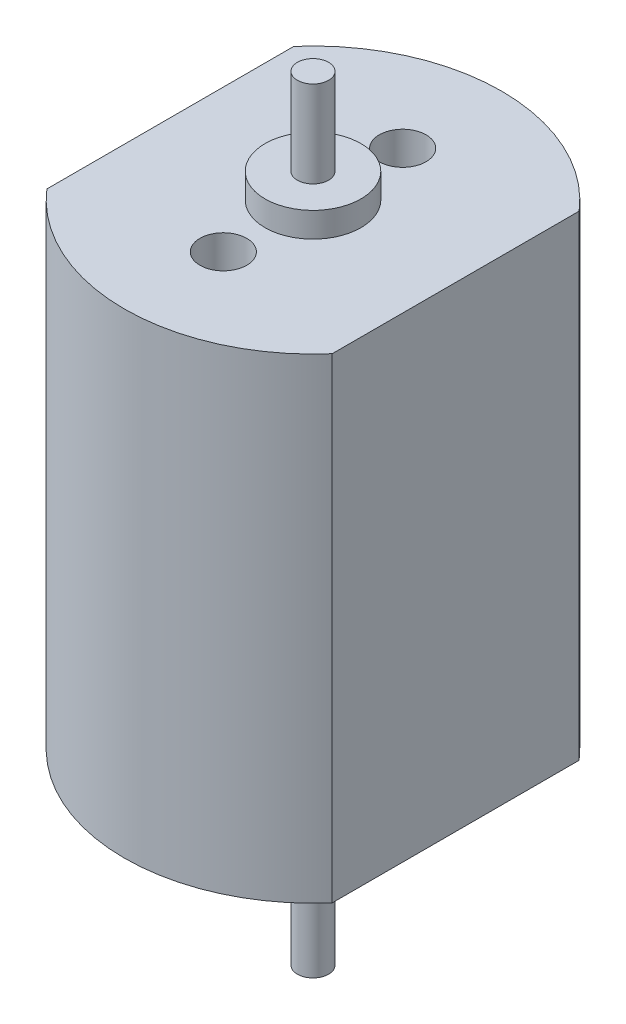
ISO-10303-21;
HEADER;
FILE_DESCRIPTION(('STEP AP214'),'2;1');
FILE_NAME('part.step','',(''),(''),'','','');
FILE_SCHEMA(('AUTOMOTIVE_DESIGN { 1 0 10303 214 1 1 1 1 }'));
ENDSEC;
DATA;
#1=APPLICATION_CONTEXT('core data for automotive mechanical design processes');
#2=APPLICATION_PROTOCOL_DEFINITION('international standard','automotive_design',2000,#1);
#3=PRODUCT_CONTEXT('',#1,'mechanical');
#4=PRODUCT('Part','Part','',(#3));
#5=PRODUCT_RELATED_PRODUCT_CATEGORY('part','',(#4));
#6=PRODUCT_DEFINITION_FORMATION('','',#4);
#7=PRODUCT_DEFINITION_CONTEXT('part definition',#1,'design');
#8=PRODUCT_DEFINITION('design','',#6,#7);
#9=PRODUCT_DEFINITION_SHAPE('','',#8);
#10=(LENGTH_UNIT() NAMED_UNIT(*) SI_UNIT(.MILLI.,.METRE.));
#11=(NAMED_UNIT(*) PLANE_ANGLE_UNIT() SI_UNIT($,.RADIAN.));
#12=(NAMED_UNIT(*) SI_UNIT($,.STERADIAN.) SOLID_ANGLE_UNIT());
#13=UNCERTAINTY_MEASURE_WITH_UNIT(LENGTH_MEASURE(1.E-05),#10,'distance_accuracy_value','');
#14=(GEOMETRIC_REPRESENTATION_CONTEXT(3) GLOBAL_UNCERTAINTY_ASSIGNED_CONTEXT((#13)) GLOBAL_UNIT_ASSIGNED_CONTEXT((#10,
#11,#12)) REPRESENTATION_CONTEXT('',''));
#15=CARTESIAN_POINT('',(0.,0.,0.));
#16=DIRECTION('',(0.,0.,1.));
#17=DIRECTION('',(1.,0.,0.));
#18=AXIS2_PLACEMENT_3D('',#15,#16,#17);
#19=CARTESIAN_POINT('',(0.,30.5,0.));
#20=DIRECTION('',(0.,-1.,0.));
#21=DIRECTION('',(0.,0.,-1.));
#22=AXIS2_PLACEMENT_3D('',#19,#20,#21);
#23=CYLINDRICAL_SURFACE('',#22,12.1);
#24=CARTESIAN_POINT('',(0.,0.,0.));
#25=DIRECTION('',(0.,1.,0.));
#26=DIRECTION('',(0.,0.,1.));
#27=AXIS2_PLACEMENT_3D('',#24,#25,#26);
#28=CIRCLE('',#27,12.1);
#29=CARTESIAN_POINT('',(-9.15,0.,7.91754381105656));
#30=VERTEX_POINT('',#29);
#31=CARTESIAN_POINT('',(9.15,0.,7.91754381105656));
#32=VERTEX_POINT('',#31);
#33=EDGE_CURVE('E114',#30,#32,#28,.T.);
#34=ORIENTED_EDGE('',*,*,#33,.T.);
#35=DIRECTION('',(0.,-1.,0.));
#36=VECTOR('',#35,1.);
#37=CARTESIAN_POINT('',(9.15,30.5,7.91754381105656));
#38=LINE('',#37,#36);
#39=CARTESIAN_POINT('',(9.15,30.5,7.91754381105656));
#40=VERTEX_POINT('',#39);
#41=EDGE_CURVE('E50',#40,#32,#38,.T.);
#42=ORIENTED_EDGE('',*,*,#41,.F.);
#43=CARTESIAN_POINT('',(0.,30.5,0.));
#44=DIRECTION('',(0.,1.,0.));
#45=DIRECTION('',(0.,0.,1.));
#46=AXIS2_PLACEMENT_3D('',#43,#44,#45);
#47=CIRCLE('',#46,12.1);
#48=CARTESIAN_POINT('',(-9.15,30.5,7.91754381105656));
#49=VERTEX_POINT('',#48);
#50=EDGE_CURVE('E101',#49,#40,#47,.T.);
#51=ORIENTED_EDGE('',*,*,#50,.F.);
#52=DIRECTION('',(0.,-1.,0.));
#53=VECTOR('',#52,1.);
#54=CARTESIAN_POINT('',(-9.15,30.5,7.91754381105656));
#55=LINE('',#54,#53);
#56=EDGE_CURVE('E110',#49,#30,#55,.T.);
#57=ORIENTED_EDGE('',*,*,#56,.T.);
#58=EDGE_LOOP('',(#34,#42,#51,#57));
#59=FACE_BOUND('',#58,.T.);
#60=ADVANCED_FACE('F47',(#59),#23,.T.);
#61=CARTESIAN_POINT('',(9.15,30.5,-7.91754381105656));
#62=DIRECTION('',(-1.,0.,0.));
#63=DIRECTION('',(0.,0.,1.));
#64=AXIS2_PLACEMENT_3D('',#61,#62,#63);
#65=PLANE('',#64);
#66=DIRECTION('',(0.,0.,-1.));
#67=VECTOR('',#66,1.);
#68=CARTESIAN_POINT('',(9.15,0.,-7.91754381105656));
#69=LINE('',#68,#67);
#70=CARTESIAN_POINT('',(9.15,0.,-7.91754381105656));
#71=VERTEX_POINT('',#70);
#72=EDGE_CURVE('E106',#32,#71,#69,.T.);
#73=ORIENTED_EDGE('',*,*,#72,.T.);
#74=DIRECTION('',(0.,-1.,0.));
#75=VECTOR('',#74,1.);
#76=CARTESIAN_POINT('',(9.15,30.5,-7.91754381105656));
#77=LINE('',#76,#75);
#78=CARTESIAN_POINT('',(9.15,30.5,-7.91754381105656));
#79=VERTEX_POINT('',#78);
#80=EDGE_CURVE('E104',#79,#71,#77,.T.);
#81=ORIENTED_EDGE('',*,*,#80,.F.);
#82=DIRECTION('',(0.,0.,-1.));
#83=VECTOR('',#82,1.);
#84=CARTESIAN_POINT('',(9.15,30.5,-7.91754381105656));
#85=LINE('',#84,#83);
#86=EDGE_CURVE('E96',#40,#79,#85,.T.);
#87=ORIENTED_EDGE('',*,*,#86,.F.);
#88=ORIENTED_EDGE('',*,*,#41,.T.);
#89=EDGE_LOOP('',(#73,#81,#87,#88));
#90=FACE_BOUND('',#89,.T.);
#91=ADVANCED_FACE('F105',(#90),#65,.F.);
#92=CARTESIAN_POINT('',(0.,30.5,0.));
#93=DIRECTION('',(0.,-1.,0.));
#94=DIRECTION('',(0.,0.,-1.));
#95=AXIS2_PLACEMENT_3D('',#92,#93,#94);
#96=CYLINDRICAL_SURFACE('',#95,12.1);
#97=CARTESIAN_POINT('',(0.,0.,0.));
#98=DIRECTION('',(0.,1.,0.));
#99=DIRECTION('',(0.,0.,1.));
#100=AXIS2_PLACEMENT_3D('',#97,#98,#99);
#101=CIRCLE('',#100,12.1);
#102=CARTESIAN_POINT('',(-9.15,0.,-7.91754381105656));
#103=VERTEX_POINT('',#102);
#104=EDGE_CURVE('E82',#71,#103,#101,.T.);
#105=ORIENTED_EDGE('',*,*,#104,.T.);
#106=DIRECTION('',(0.,-1.,0.));
#107=VECTOR('',#106,1.);
#108=CARTESIAN_POINT('',(-9.15,30.5,-7.91754381105656));
#109=LINE('',#108,#107);
#110=CARTESIAN_POINT('',(-9.15,30.5,-7.91754381105656));
#111=VERTEX_POINT('',#110);
#112=EDGE_CURVE('E107',#111,#103,#109,.T.);
#113=ORIENTED_EDGE('',*,*,#112,.F.);
#114=CARTESIAN_POINT('',(0.,30.5,0.));
#115=DIRECTION('',(0.,1.,0.));
#116=DIRECTION('',(0.,0.,1.));
#117=AXIS2_PLACEMENT_3D('',#114,#115,#116);
#118=CIRCLE('',#117,12.1);
#119=EDGE_CURVE('E99',#79,#111,#118,.T.);
#120=ORIENTED_EDGE('',*,*,#119,.F.);
#121=ORIENTED_EDGE('',*,*,#80,.T.);
#122=EDGE_LOOP('',(#105,#113,#120,#121));
#123=FACE_BOUND('',#122,.T.);
#124=ADVANCED_FACE('F108',(#123),#96,.T.);
#125=CARTESIAN_POINT('',(-9.15,30.5,-7.91754381105656));
#126=DIRECTION('',(1.,0.,0.));
#127=DIRECTION('',(0.,0.,-1.));
#128=AXIS2_PLACEMENT_3D('',#125,#126,#127);
#129=PLANE('',#128);
#130=DIRECTION('',(0.,0.,1.));
#131=VECTOR('',#130,1.);
#132=CARTESIAN_POINT('',(-9.15,0.,-7.91754381105656));
#133=LINE('',#132,#131);
#134=EDGE_CURVE('E88',#103,#30,#133,.T.);
#135=ORIENTED_EDGE('',*,*,#134,.T.);
#136=ORIENTED_EDGE('',*,*,#56,.F.);
#137=DIRECTION('',(0.,0.,1.));
#138=VECTOR('',#137,1.);
#139=CARTESIAN_POINT('',(-9.15,30.5,-7.91754381105656));
#140=LINE('',#139,#138);
#141=EDGE_CURVE('E65',#111,#49,#140,.T.);
#142=ORIENTED_EDGE('',*,*,#141,.F.);
#143=ORIENTED_EDGE('',*,*,#112,.T.);
#144=EDGE_LOOP('',(#135,#136,#142,#143));
#145=FACE_BOUND('',#144,.T.);
#146=ADVANCED_FACE('F122',(#145),#129,.F.);
#147=CARTESIAN_POINT('',(0.,30.5,0.));
#148=DIRECTION('',(0.,1.,0.));
#149=DIRECTION('',(0.,0.,1.));
#150=AXIS2_PLACEMENT_3D('',#147,#148,#149);
#151=PLANE('',#150);
#152=CARTESIAN_POINT('',(0.,30.5,-5.75));
#153=DIRECTION('',(0.,1.,0.));
#154=DIRECTION('',(0.,0.,1.));
#155=AXIS2_PLACEMENT_3D('',#152,#153,#154);
#156=CIRCLE('',#155,1.5);
#157=CARTESIAN_POINT('',(0.,30.5,-4.25));
#158=VERTEX_POINT('',#157);
#159=EDGE_CURVE('E154',#158,#158,#156,.T.);
#160=ORIENTED_EDGE('',*,*,#159,.F.);
#161=EDGE_LOOP('',(#160));
#162=FACE_BOUND('',#161,.T.);
#163=CARTESIAN_POINT('',(0.,30.5,5.75));
#164=DIRECTION('',(0.,1.,0.));
#165=DIRECTION('',(0.,0.,1.));
#166=AXIS2_PLACEMENT_3D('',#163,#164,#165);
#167=CIRCLE('',#166,1.5);
#168=CARTESIAN_POINT('',(0.,30.5,7.25));
#169=VERTEX_POINT('',#168);
#170=EDGE_CURVE('E151',#169,#169,#167,.T.);
#171=ORIENTED_EDGE('',*,*,#170,.F.);
#172=EDGE_LOOP('',(#171));
#173=FACE_BOUND('',#172,.T.);
#174=CARTESIAN_POINT('',(0.,30.5,0.));
#175=DIRECTION('',(0.,1.,0.));
#176=DIRECTION('',(0.,0.,1.));
#177=AXIS2_PLACEMENT_3D('',#174,#175,#176);
#178=CIRCLE('',#177,3.075);
#179=CARTESIAN_POINT('',(0.,30.5,3.075));
#180=VERTEX_POINT('',#179);
#181=EDGE_CURVE('E56',#180,#180,#178,.T.);
#182=ORIENTED_EDGE('',*,*,#181,.F.);
#183=EDGE_LOOP('',(#182));
#184=FACE_BOUND('',#183,.T.);
#185=ORIENTED_EDGE('',*,*,#50,.T.);
#186=ORIENTED_EDGE('',*,*,#86,.T.);
#187=ORIENTED_EDGE('',*,*,#119,.T.);
#188=ORIENTED_EDGE('',*,*,#141,.T.);
#189=EDGE_LOOP('',(#185,#186,#187,#188));
#190=FACE_BOUND('',#189,.T.);
#191=ADVANCED_FACE('F97',(#162,#173,#184,#190),#151,.T.);
#192=CARTESIAN_POINT('',(0.,0.,0.));
#193=DIRECTION('',(0.,1.,0.));
#194=DIRECTION('',(0.,0.,1.));
#195=AXIS2_PLACEMENT_3D('',#192,#193,#194);
#196=PLANE('',#195);
#197=CARTESIAN_POINT('',(0.,0.,0.));
#198=DIRECTION('',(0.,-1.,0.));
#199=DIRECTION('',(0.,0.,-1.));
#200=AXIS2_PLACEMENT_3D('',#197,#198,#199);
#201=CIRCLE('',#200,4.);
#202=CARTESIAN_POINT('',(0.,0.,-4.));
#203=VERTEX_POINT('',#202);
#204=EDGE_CURVE('E11',#203,#203,#201,.T.);
#205=ORIENTED_EDGE('',*,*,#204,.F.);
#206=EDGE_LOOP('',(#205));
#207=FACE_BOUND('',#206,.T.);
#208=ORIENTED_EDGE('',*,*,#33,.F.);
#209=ORIENTED_EDGE('',*,*,#134,.F.);
#210=ORIENTED_EDGE('',*,*,#104,.F.);
#211=ORIENTED_EDGE('',*,*,#72,.F.);
#212=EDGE_LOOP('',(#208,#209,#210,#211));
#213=FACE_BOUND('',#212,.T.);
#214=ADVANCED_FACE('F125',(#207,#213),#196,.F.);
#215=CARTESIAN_POINT('',(0.,32.1,0.));
#216=DIRECTION('',(0.,1.,0.));
#217=DIRECTION('',(0.,0.,1.));
#218=AXIS2_PLACEMENT_3D('',#215,#216,#217);
#219=PLANE('',#218);
#220=CARTESIAN_POINT('',(0.,32.1,0.));
#221=DIRECTION('',(0.,1.,0.));
#222=DIRECTION('',(0.,0.,1.));
#223=AXIS2_PLACEMENT_3D('',#220,#221,#222);
#224=CIRCLE('',#223,3.075);
#225=CARTESIAN_POINT('',(0.,32.1,3.075));
#226=VERTEX_POINT('',#225);
#227=EDGE_CURVE('E117',#226,#226,#224,.T.);
#228=ORIENTED_EDGE('',*,*,#227,.T.);
#229=EDGE_LOOP('',(#228));
#230=FACE_BOUND('',#229,.T.);
#231=CARTESIAN_POINT('',(0.,32.1,0.));
#232=DIRECTION('',(0.,1.,0.));
#233=DIRECTION('',(0.,0.,1.));
#234=AXIS2_PLACEMENT_3D('',#231,#232,#233);
#235=CIRCLE('',#234,1.);
#236=CARTESIAN_POINT('',(0.,32.1,1.));
#237=VERTEX_POINT('',#236);
#238=EDGE_CURVE('E132',#237,#237,#235,.T.);
#239=ORIENTED_EDGE('',*,*,#238,.F.);
#240=EDGE_LOOP('',(#239));
#241=FACE_BOUND('',#240,.T.);
#242=ADVANCED_FACE('F179',(#230,#241),#219,.T.);
#243=CARTESIAN_POINT('',(0.,32.1,0.));
#244=DIRECTION('',(0.,-1.,0.));
#245=DIRECTION('',(0.,0.,-1.));
#246=AXIS2_PLACEMENT_3D('',#243,#244,#245);
#247=CYLINDRICAL_SURFACE('',#246,3.075);
#248=ORIENTED_EDGE('',*,*,#227,.F.);
#249=EDGE_LOOP('',(#248));
#250=FACE_BOUND('',#249,.T.);
#251=ORIENTED_EDGE('',*,*,#181,.T.);
#252=EDGE_LOOP('',(#251));
#253=FACE_BOUND('',#252,.T.);
#254=ADVANCED_FACE('F176',(#250,#253),#247,.T.);
#255=CARTESIAN_POINT('',(0.,37.65,0.));
#256=DIRECTION('',(0.,-1.,0.));
#257=DIRECTION('',(0.,0.,-1.));
#258=AXIS2_PLACEMENT_3D('',#255,#256,#257);
#259=CYLINDRICAL_SURFACE('',#258,1.);
#260=ORIENTED_EDGE('',*,*,#238,.T.);
#261=EDGE_LOOP('',(#260));
#262=FACE_BOUND('',#261,.T.);
#263=CARTESIAN_POINT('',(0.,37.65,0.));
#264=DIRECTION('',(0.,1.,0.));
#265=DIRECTION('',(0.,0.,1.));
#266=AXIS2_PLACEMENT_3D('',#263,#264,#265);
#267=CIRCLE('',#266,1.);
#268=CARTESIAN_POINT('',(0.,37.65,1.));
#269=VERTEX_POINT('',#268);
#270=EDGE_CURVE('E135',#269,#269,#267,.T.);
#271=ORIENTED_EDGE('',*,*,#270,.F.);
#272=EDGE_LOOP('',(#271));
#273=FACE_BOUND('',#272,.T.);
#274=ADVANCED_FACE('F178',(#262,#273),#259,.T.);
#275=CARTESIAN_POINT('',(0.,37.65,0.));
#276=DIRECTION('',(0.,1.,0.));
#277=DIRECTION('',(0.,0.,1.));
#278=AXIS2_PLACEMENT_3D('',#275,#276,#277);
#279=PLANE('',#278);
#280=ORIENTED_EDGE('',*,*,#270,.T.);
#281=EDGE_LOOP('',(#280));
#282=FACE_BOUND('',#281,.T.);
#283=ADVANCED_FACE('F186',(#282),#279,.T.);
#284=CARTESIAN_POINT('',(0.,-2.,0.));
#285=DIRECTION('',(0.,-1.,0.));
#286=DIRECTION('',(0.,0.,-1.));
#287=AXIS2_PLACEMENT_3D('',#284,#285,#286);
#288=PLANE('',#287);
#289=CARTESIAN_POINT('',(0.,-2.,0.));
#290=DIRECTION('',(0.,-1.,0.));
#291=DIRECTION('',(0.,0.,-1.));
#292=AXIS2_PLACEMENT_3D('',#289,#290,#291);
#293=CIRCLE('',#292,4.);
#294=CARTESIAN_POINT('',(0.,-2.,-4.));
#295=VERTEX_POINT('',#294);
#296=EDGE_CURVE('E137',#295,#295,#293,.T.);
#297=ORIENTED_EDGE('',*,*,#296,.T.);
#298=EDGE_LOOP('',(#297));
#299=FACE_BOUND('',#298,.T.);
#300=CARTESIAN_POINT('',(0.,-2.,0.));
#301=DIRECTION('',(0.,-1.,0.));
#302=DIRECTION('',(0.,0.,-1.));
#303=AXIS2_PLACEMENT_3D('',#300,#301,#302);
#304=CIRCLE('',#303,1.);
#305=CARTESIAN_POINT('',(0.,-2.,-1.));
#306=VERTEX_POINT('',#305);
#307=EDGE_CURVE('E141',#306,#306,#304,.T.);
#308=ORIENTED_EDGE('',*,*,#307,.F.);
#309=EDGE_LOOP('',(#308));
#310=FACE_BOUND('',#309,.T.);
#311=ADVANCED_FACE('F214',(#299,#310),#288,.T.);
#312=CARTESIAN_POINT('',(0.,-2.,0.));
#313=DIRECTION('',(0.,1.,0.));
#314=DIRECTION('',(0.,0.,1.));
#315=AXIS2_PLACEMENT_3D('',#312,#313,#314);
#316=CYLINDRICAL_SURFACE('',#315,4.);
#317=ORIENTED_EDGE('',*,*,#296,.F.);
#318=EDGE_LOOP('',(#317));
#319=FACE_BOUND('',#318,.T.);
#320=ORIENTED_EDGE('',*,*,#204,.T.);
#321=EDGE_LOOP('',(#320));
#322=FACE_BOUND('',#321,.T.);
#323=ADVANCED_FACE('F211',(#319,#322),#316,.T.);
#324=CARTESIAN_POINT('',(0.,-12.,0.));
#325=DIRECTION('',(0.,1.,0.));
#326=DIRECTION('',(0.,0.,1.));
#327=AXIS2_PLACEMENT_3D('',#324,#325,#326);
#328=CYLINDRICAL_SURFACE('',#327,1.);
#329=ORIENTED_EDGE('',*,*,#307,.T.);
#330=EDGE_LOOP('',(#329));
#331=FACE_BOUND('',#330,.T.);
#332=CARTESIAN_POINT('',(0.,-12.,0.));
#333=DIRECTION('',(0.,-1.,0.));
#334=DIRECTION('',(0.,0.,-1.));
#335=AXIS2_PLACEMENT_3D('',#332,#333,#334);
#336=CIRCLE('',#335,1.);
#337=CARTESIAN_POINT('',(0.,-12.,-1.));
#338=VERTEX_POINT('',#337);
#339=EDGE_CURVE('E144',#338,#338,#336,.T.);
#340=ORIENTED_EDGE('',*,*,#339,.F.);
#341=EDGE_LOOP('',(#340));
#342=FACE_BOUND('',#341,.T.);
#343=ADVANCED_FACE('F213',(#331,#342),#328,.T.);
#344=CARTESIAN_POINT('',(0.,-12.,0.));
#345=DIRECTION('',(0.,-1.,0.));
#346=DIRECTION('',(0.,0.,-1.));
#347=AXIS2_PLACEMENT_3D('',#344,#345,#346);
#348=PLANE('',#347);
#349=ORIENTED_EDGE('',*,*,#339,.T.);
#350=EDGE_LOOP('',(#349));
#351=FACE_BOUND('',#350,.T.);
#352=ADVANCED_FACE('F220',(#351),#348,.T.);
#353=CARTESIAN_POINT('',(0.,25.5,5.75));
#354=DIRECTION('',(0.,1.,0.));
#355=DIRECTION('',(0.,0.,1.));
#356=AXIS2_PLACEMENT_3D('',#353,#354,#355);
#357=CYLINDRICAL_SURFACE('',#356,1.5);
#358=CARTESIAN_POINT('',(0.,25.5,5.75));
#359=DIRECTION('',(0.,1.,0.));
#360=DIRECTION('',(0.,0.,1.));
#361=AXIS2_PLACEMENT_3D('',#358,#359,#360);
#362=CIRCLE('',#361,1.5);
#363=CARTESIAN_POINT('',(0.,25.5,7.25));
#364=VERTEX_POINT('',#363);
#365=EDGE_CURVE('E148',#364,#364,#362,.T.);
#366=ORIENTED_EDGE('',*,*,#365,.F.);
#367=EDGE_LOOP('',(#366));
#368=FACE_BOUND('',#367,.T.);
#369=ORIENTED_EDGE('',*,*,#170,.T.);
#370=EDGE_LOOP('',(#369));
#371=FACE_BOUND('',#370,.T.);
#372=ADVANCED_FACE('F286',(#368,#371),#357,.F.);
#373=CARTESIAN_POINT('',(0.,25.5,5.75));
#374=DIRECTION('',(0.,1.,0.));
#375=DIRECTION('',(0.,0.,1.));
#376=AXIS2_PLACEMENT_3D('',#373,#374,#375);
#377=PLANE('',#376);
#378=ORIENTED_EDGE('',*,*,#365,.T.);
#379=EDGE_LOOP('',(#378));
#380=FACE_BOUND('',#379,.T.);
#381=ADVANCED_FACE('F165',(#380),#377,.T.);
#382=CARTESIAN_POINT('',(0.,25.5,-5.75));
#383=DIRECTION('',(0.,1.,0.));
#384=DIRECTION('',(0.,0.,1.));
#385=AXIS2_PLACEMENT_3D('',#382,#383,#384);
#386=CYLINDRICAL_SURFACE('',#385,1.5);
#387=CARTESIAN_POINT('',(0.,25.5,-5.75));
#388=DIRECTION('',(0.,1.,0.));
#389=DIRECTION('',(0.,0.,1.));
#390=AXIS2_PLACEMENT_3D('',#387,#388,#389);
#391=CIRCLE('',#390,1.5);
#392=CARTESIAN_POINT('',(0.,25.5,-4.25));
#393=VERTEX_POINT('',#392);
#394=EDGE_CURVE('E147',#393,#393,#391,.T.);
#395=ORIENTED_EDGE('',*,*,#394,.F.);
#396=EDGE_LOOP('',(#395));
#397=FACE_BOUND('',#396,.T.);
#398=ORIENTED_EDGE('',*,*,#159,.T.);
#399=EDGE_LOOP('',(#398));
#400=FACE_BOUND('',#399,.T.);
#401=ADVANCED_FACE('F162',(#397,#400),#386,.F.);
#402=CARTESIAN_POINT('',(0.,25.5,-5.75));
#403=DIRECTION('',(0.,1.,0.));
#404=DIRECTION('',(0.,0.,1.));
#405=AXIS2_PLACEMENT_3D('',#402,#403,#404);
#406=PLANE('',#405);
#407=ORIENTED_EDGE('',*,*,#394,.T.);
#408=EDGE_LOOP('',(#407));
#409=FACE_BOUND('',#408,.T.);
#410=ADVANCED_FACE('F160',(#409),#406,.T.);
#411=CLOSED_SHELL('',(#60,#91,#124,#146,#191,#214,#242,#254,#274,#283,#311,#323,#343,#352,#372,
#381,#401,#410));
#412=MANIFOLD_SOLID_BREP('B2',#411);
#413=ADVANCED_BREP_SHAPE_REPRESENTATION('',(#18,#412),#14);
#414=SHAPE_DEFINITION_REPRESENTATION(#9,#413);
ENDSEC;
END-ISO-10303-21;
